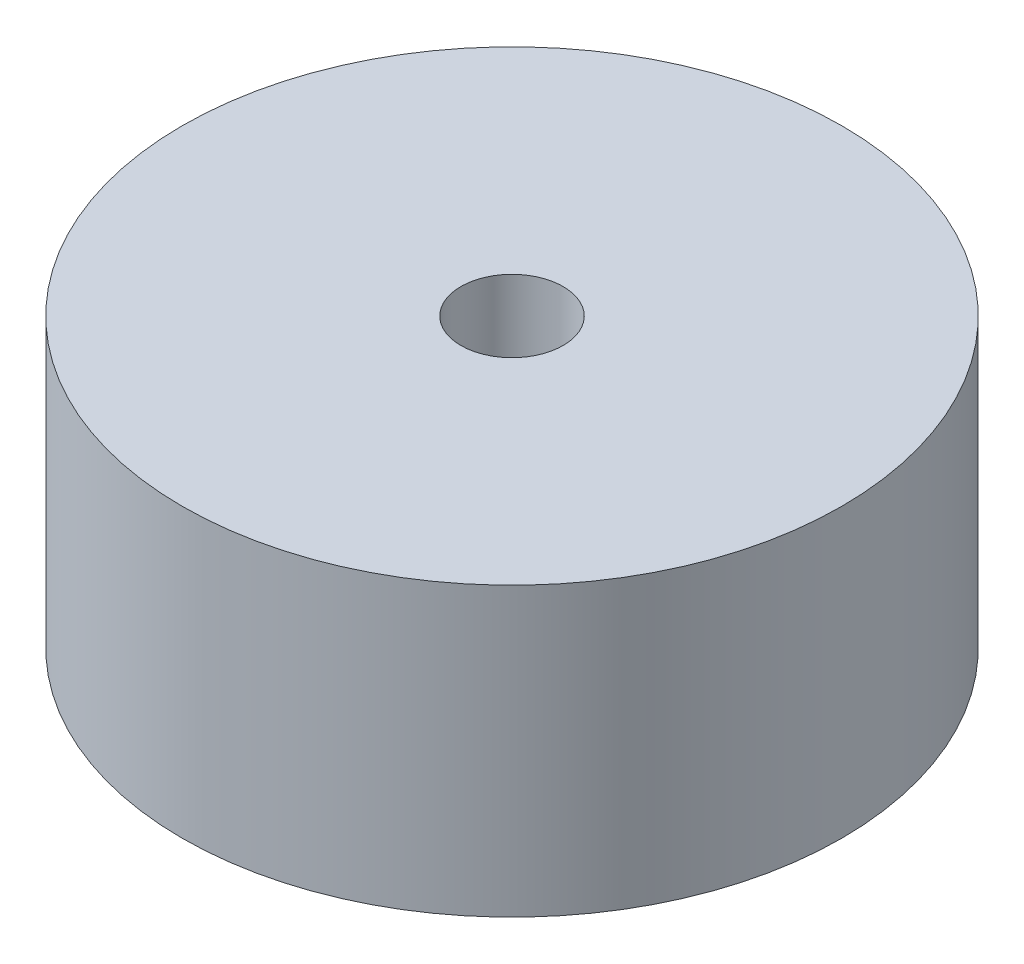
ISO-10303-21;
HEADER;
FILE_DESCRIPTION(('STEP AP214'),'2;1');
FILE_NAME('part.step','',(''),(''),'','','');
FILE_SCHEMA(('AUTOMOTIVE_DESIGN { 1 0 10303 214 1 1 1 1 }'));
ENDSEC;
DATA;
#1=APPLICATION_CONTEXT('core data for automotive mechanical design processes');
#2=APPLICATION_PROTOCOL_DEFINITION('international standard','automotive_design',2000,#1);
#3=PRODUCT_CONTEXT('',#1,'mechanical');
#4=PRODUCT('Part','Part','',(#3));
#5=PRODUCT_RELATED_PRODUCT_CATEGORY('part','',(#4));
#6=PRODUCT_DEFINITION_FORMATION('','',#4);
#7=PRODUCT_DEFINITION_CONTEXT('part definition',#1,'design');
#8=PRODUCT_DEFINITION('design','',#6,#7);
#9=PRODUCT_DEFINITION_SHAPE('','',#8);
#10=(LENGTH_UNIT() NAMED_UNIT(*) SI_UNIT(.MILLI.,.METRE.));
#11=(NAMED_UNIT(*) PLANE_ANGLE_UNIT() SI_UNIT($,.RADIAN.));
#12=(NAMED_UNIT(*) SI_UNIT($,.STERADIAN.) SOLID_ANGLE_UNIT());
#13=UNCERTAINTY_MEASURE_WITH_UNIT(LENGTH_MEASURE(1.E-05),#10,'distance_accuracy_value','');
#14=(GEOMETRIC_REPRESENTATION_CONTEXT(3) GLOBAL_UNCERTAINTY_ASSIGNED_CONTEXT((#13)) GLOBAL_UNIT_ASSIGNED_CONTEXT((#10,
#11,#12)) REPRESENTATION_CONTEXT('',''));
#15=CARTESIAN_POINT('',(0.,0.,0.));
#16=DIRECTION('',(0.,0.,1.));
#17=DIRECTION('',(1.,0.,0.));
#18=AXIS2_PLACEMENT_3D('',#15,#16,#17);
#19=CARTESIAN_POINT('',(0.,50.,0.));
#20=DIRECTION('',(0.,-1.,0.));
#21=DIRECTION('',(0.,0.,-1.));
#22=AXIS2_PLACEMENT_3D('',#19,#20,#21);
#23=CYLINDRICAL_SURFACE('',#22,57.34);
#24=CARTESIAN_POINT('',(0.,50.,0.));
#25=DIRECTION('',(0.,1.,0.));
#26=DIRECTION('',(0.,0.,1.));
#27=AXIS2_PLACEMENT_3D('',#24,#25,#26);
#28=CIRCLE('',#27,57.34);
#29=CARTESIAN_POINT('',(0.,50.,57.34));
#30=VERTEX_POINT('',#29);
#31=EDGE_CURVE('E10',#30,#30,#28,.T.);
#32=ORIENTED_EDGE('',*,*,#31,.F.);
#33=EDGE_LOOP('',(#32));
#34=FACE_BOUND('',#33,.T.);
#35=CARTESIAN_POINT('',(0.,0.,0.));
#36=DIRECTION('',(0.,1.,0.));
#37=DIRECTION('',(0.,0.,1.));
#38=AXIS2_PLACEMENT_3D('',#35,#36,#37);
#39=CIRCLE('',#38,57.34);
#40=CARTESIAN_POINT('',(0.,0.,57.34));
#41=VERTEX_POINT('',#40);
#42=EDGE_CURVE('E33',#41,#41,#39,.T.);
#43=ORIENTED_EDGE('',*,*,#42,.T.);
#44=EDGE_LOOP('',(#43));
#45=FACE_BOUND('',#44,.T.);
#46=ADVANCED_FACE('F30',(#34,#45),#23,.T.);
#47=CARTESIAN_POINT('',(0.,50.,0.));
#48=DIRECTION('',(0.,1.,0.));
#49=DIRECTION('',(0.,0.,1.));
#50=AXIS2_PLACEMENT_3D('',#47,#48,#49);
#51=PLANE('',#50);
#52=CARTESIAN_POINT('',(0.,50.,0.));
#53=DIRECTION('',(0.,1.,0.));
#54=DIRECTION('',(0.,0.,1.));
#55=AXIS2_PLACEMENT_3D('',#52,#53,#54);
#56=CIRCLE('',#55,8.89);
#57=CARTESIAN_POINT('',(0.,50.,8.89));
#58=VERTEX_POINT('',#57);
#59=EDGE_CURVE('E42',#58,#58,#56,.T.);
#60=ORIENTED_EDGE('',*,*,#59,.F.);
#61=EDGE_LOOP('',(#60));
#62=FACE_BOUND('',#61,.T.);
#63=ORIENTED_EDGE('',*,*,#31,.T.);
#64=EDGE_LOOP('',(#63));
#65=FACE_BOUND('',#64,.T.);
#66=ADVANCED_FACE('F57',(#62,#65),#51,.T.);
#67=CARTESIAN_POINT('',(0.,0.,0.));
#68=DIRECTION('',(0.,1.,0.));
#69=DIRECTION('',(0.,0.,1.));
#70=AXIS2_PLACEMENT_3D('',#67,#68,#69);
#71=PLANE('',#70);
#72=CARTESIAN_POINT('',(0.,0.,0.));
#73=DIRECTION('',(0.,1.,0.));
#74=DIRECTION('',(0.,0.,1.));
#75=AXIS2_PLACEMENT_3D('',#72,#73,#74);
#76=CIRCLE('',#75,8.89);
#77=CARTESIAN_POINT('',(0.,0.,8.89));
#78=VERTEX_POINT('',#77);
#79=EDGE_CURVE('E40',#78,#78,#76,.T.);
#80=ORIENTED_EDGE('',*,*,#79,.T.);
#81=EDGE_LOOP('',(#80));
#82=FACE_BOUND('',#81,.T.);
#83=ORIENTED_EDGE('',*,*,#42,.F.);
#84=EDGE_LOOP('',(#83));
#85=FACE_BOUND('',#84,.T.);
#86=ADVANCED_FACE('F48',(#82,#85),#71,.F.);
#87=CARTESIAN_POINT('',(0.,0.,0.));
#88=DIRECTION('',(0.,1.,0.));
#89=DIRECTION('',(0.,0.,1.));
#90=AXIS2_PLACEMENT_3D('',#87,#88,#89);
#91=CYLINDRICAL_SURFACE('',#90,8.89);
#92=ORIENTED_EDGE('',*,*,#79,.F.);
#93=EDGE_LOOP('',(#92));
#94=FACE_BOUND('',#93,.T.);
#95=ORIENTED_EDGE('',*,*,#59,.T.);
#96=EDGE_LOOP('',(#95));
#97=FACE_BOUND('',#96,.T.);
#98=ADVANCED_FACE('F51',(#94,#97),#91,.F.);
#99=CLOSED_SHELL('',(#46,#66,#86,#98));
#100=MANIFOLD_SOLID_BREP('B2',#99);
#101=ADVANCED_BREP_SHAPE_REPRESENTATION('',(#18,#100),#14);
#102=SHAPE_DEFINITION_REPRESENTATION(#9,#101);
ENDSEC;
END-ISO-10303-21;
